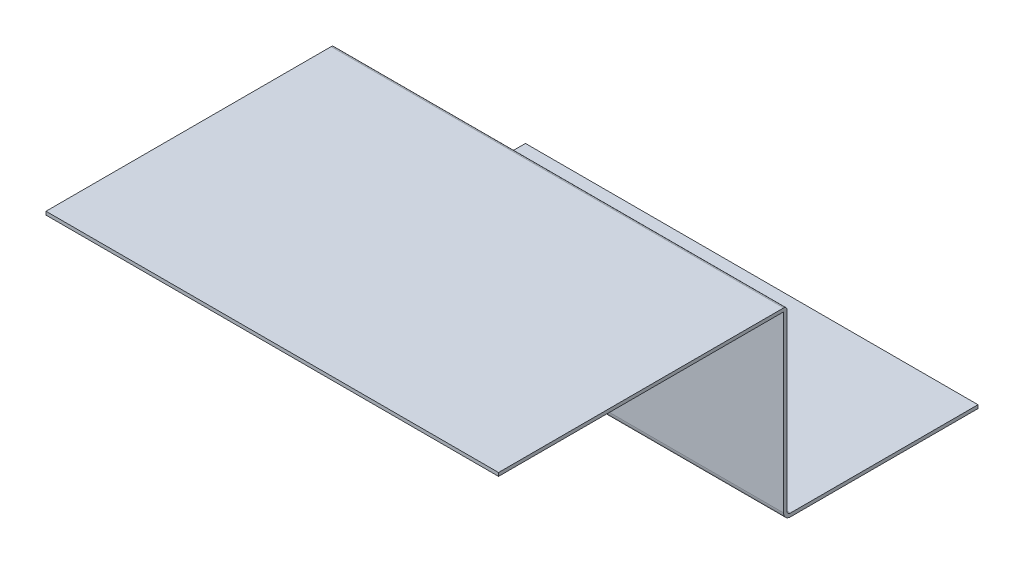
ISO-10303-21;
HEADER;
FILE_DESCRIPTION(('STEP AP214'),'2;1');
FILE_NAME('part.step','',(''),(''),'','','');
FILE_SCHEMA(('AUTOMOTIVE_DESIGN { 1 0 10303 214 1 1 1 1 }'));
ENDSEC;
DATA;
#1=APPLICATION_CONTEXT('core data for automotive mechanical design processes');
#2=APPLICATION_PROTOCOL_DEFINITION('international standard','automotive_design',2000,#1);
#3=PRODUCT_CONTEXT('',#1,'mechanical');
#4=PRODUCT('Part','Part','',(#3));
#5=PRODUCT_RELATED_PRODUCT_CATEGORY('part','',(#4));
#6=PRODUCT_DEFINITION_FORMATION('','',#4);
#7=PRODUCT_DEFINITION_CONTEXT('part definition',#1,'design');
#8=PRODUCT_DEFINITION('design','',#6,#7);
#9=PRODUCT_DEFINITION_SHAPE('','',#8);
#10=(LENGTH_UNIT() NAMED_UNIT(*) SI_UNIT(.MILLI.,.METRE.));
#11=(NAMED_UNIT(*) PLANE_ANGLE_UNIT() SI_UNIT($,.RADIAN.));
#12=(NAMED_UNIT(*) SI_UNIT($,.STERADIAN.) SOLID_ANGLE_UNIT());
#13=UNCERTAINTY_MEASURE_WITH_UNIT(LENGTH_MEASURE(1.E-05),#10,'distance_accuracy_value','');
#14=(GEOMETRIC_REPRESENTATION_CONTEXT(3) GLOBAL_UNCERTAINTY_ASSIGNED_CONTEXT((#13)) GLOBAL_UNIT_ASSIGNED_CONTEXT((#10,
#11,#12)) REPRESENTATION_CONTEXT('',''));
#15=CARTESIAN_POINT('',(0.,0.,0.));
#16=DIRECTION('',(0.,0.,1.));
#17=DIRECTION('',(1.,0.,0.));
#18=AXIS2_PLACEMENT_3D('',#15,#16,#17);
#19=CARTESIAN_POINT('',(400.,0.,255.));
#20=DIRECTION('',(0.,0.,-1.));
#21=DIRECTION('',(-1.,0.,0.));
#22=AXIS2_PLACEMENT_3D('',#19,#20,#21);
#23=PLANE('',#22);
#24=DIRECTION('',(0.,-1.,0.));
#25=VECTOR('',#24,1.);
#26=CARTESIAN_POINT('',(0.,0.,255.));
#27=LINE('',#26,#25);
#28=CARTESIAN_POINT('',(0.,0.,255.));
#29=VERTEX_POINT('',#28);
#30=CARTESIAN_POINT('',(0.,-3.,255.));
#31=VERTEX_POINT('',#30);
#32=EDGE_CURVE('E147',#29,#31,#27,.T.);
#33=ORIENTED_EDGE('',*,*,#32,.T.);
#34=DIRECTION('',(-1.,0.,0.));
#35=VECTOR('',#34,1.);
#36=CARTESIAN_POINT('',(400.,-3.,255.));
#37=LINE('',#36,#35);
#38=CARTESIAN_POINT('',(400.,-3.,255.));
#39=VERTEX_POINT('',#38);
#40=EDGE_CURVE('E11',#39,#31,#37,.T.);
#41=ORIENTED_EDGE('',*,*,#40,.F.);
#42=DIRECTION('',(0.,-1.,0.));
#43=VECTOR('',#42,1.);
#44=CARTESIAN_POINT('',(400.,0.,255.));
#45=LINE('',#44,#43);
#46=CARTESIAN_POINT('',(400.,0.,255.));
#47=VERTEX_POINT('',#46);
#48=EDGE_CURVE('E167',#47,#39,#45,.T.);
#49=ORIENTED_EDGE('',*,*,#48,.F.);
#50=DIRECTION('',(-1.,0.,0.));
#51=VECTOR('',#50,1.);
#52=CARTESIAN_POINT('',(400.,0.,255.));
#53=LINE('',#52,#51);
#54=EDGE_CURVE('E143',#47,#29,#53,.T.);
#55=ORIENTED_EDGE('',*,*,#54,.T.);
#56=EDGE_LOOP('',(#33,#41,#49,#55));
#57=FACE_BOUND('',#56,.T.);
#58=ADVANCED_FACE('F33',(#57),#23,.F.);
#59=CARTESIAN_POINT('',(400.,-3.00000000000002,3.));
#60=DIRECTION('',(0.,1.,0.));
#61=DIRECTION('',(0.,0.,1.));
#62=AXIS2_PLACEMENT_3D('',#59,#60,#61);
#63=PLANE('',#62);
#64=DIRECTION('',(0.,0.,-1.));
#65=VECTOR('',#64,1.);
#66=CARTESIAN_POINT('',(0.,-3.00000000000002,3.));
#67=LINE('',#66,#65);
#68=CARTESIAN_POINT('',(0.,-3.00000000000002,3.));
#69=VERTEX_POINT('',#68);
#70=EDGE_CURVE('E150',#31,#69,#67,.T.);
#71=ORIENTED_EDGE('',*,*,#70,.T.);
#72=DIRECTION('',(-1.,0.,0.));
#73=VECTOR('',#72,1.);
#74=CARTESIAN_POINT('',(400.,-3.00000000000002,3.));
#75=LINE('',#74,#73);
#76=CARTESIAN_POINT('',(400.,-3.00000000000002,3.));
#77=VERTEX_POINT('',#76);
#78=EDGE_CURVE('E41',#77,#69,#75,.T.);
#79=ORIENTED_EDGE('',*,*,#78,.F.);
#80=DIRECTION('',(0.,0.,-1.));
#81=VECTOR('',#80,1.);
#82=CARTESIAN_POINT('',(400.,-3.00000000000002,3.));
#83=LINE('',#82,#81);
#84=EDGE_CURVE('E101',#39,#77,#83,.T.);
#85=ORIENTED_EDGE('',*,*,#84,.F.);
#86=ORIENTED_EDGE('',*,*,#40,.T.);
#87=EDGE_LOOP('',(#71,#79,#85,#86));
#88=FACE_BOUND('',#87,.T.);
#89=ADVANCED_FACE('F239',(#88),#63,.F.);
#90=CARTESIAN_POINT('',(400.,-3.00000000000002,3.));
#91=DIRECTION('',(0.,0.,-1.));
#92=DIRECTION('',(0.,1.,0.));
#93=AXIS2_PLACEMENT_3D('',#90,#91,#92);
#94=PLANE('',#93);
#95=DIRECTION('',(0.,-1.,0.));
#96=VECTOR('',#95,1.);
#97=CARTESIAN_POINT('',(0.,-3.00000000000002,3.));
#98=LINE('',#97,#96);
#99=CARTESIAN_POINT('',(0.,-157.,2.99999999999998));
#100=VERTEX_POINT('',#99);
#101=EDGE_CURVE('E152',#69,#100,#98,.T.);
#102=ORIENTED_EDGE('',*,*,#101,.T.);
#103=DIRECTION('',(-1.,0.,0.));
#104=VECTOR('',#103,1.);
#105=CARTESIAN_POINT('',(400.,-157.,2.99999999999998));
#106=LINE('',#105,#104);
#107=CARTESIAN_POINT('',(400.,-157.,2.99999999999998));
#108=VERTEX_POINT('',#107);
#109=EDGE_CURVE('E183',#108,#100,#106,.T.);
#110=ORIENTED_EDGE('',*,*,#109,.F.);
#111=DIRECTION('',(0.,-1.,0.));
#112=VECTOR('',#111,1.);
#113=CARTESIAN_POINT('',(400.,-3.00000000000002,3.));
#114=LINE('',#113,#112);
#115=EDGE_CURVE('E191',#77,#108,#114,.T.);
#116=ORIENTED_EDGE('',*,*,#115,.F.);
#117=ORIENTED_EDGE('',*,*,#78,.T.);
#118=EDGE_LOOP('',(#102,#110,#116,#117));
#119=FACE_BOUND('',#118,.T.);
#120=ADVANCED_FACE('F189',(#119),#94,.F.);
#121=CARTESIAN_POINT('',(400.,-157.,-3.00000000000002));
#122=DIRECTION('',(-1.,0.,0.));
#123=DIRECTION('',(0.,0.,1.));
#124=AXIS2_PLACEMENT_3D('',#121,#122,#123);
#125=CYLINDRICAL_SURFACE('',#124,6.);
#126=CARTESIAN_POINT('',(0.,-157.,-3.00000000000002));
#127=DIRECTION('',(1.,0.,0.));
#128=DIRECTION('',(0.,0.,1.));
#129=AXIS2_PLACEMENT_3D('',#126,#127,#128);
#130=CIRCLE('',#129,6.);
#131=CARTESIAN_POINT('',(0.,-163.,-3.00000000000002));
#132=VERTEX_POINT('',#131);
#133=EDGE_CURVE('E154',#100,#132,#130,.T.);
#134=ORIENTED_EDGE('',*,*,#133,.T.);
#135=DIRECTION('',(-1.,0.,0.));
#136=VECTOR('',#135,1.);
#137=CARTESIAN_POINT('',(400.,-163.,-3.00000000000002));
#138=LINE('',#137,#136);
#139=CARTESIAN_POINT('',(400.,-163.,-3.00000000000002));
#140=VERTEX_POINT('',#139);
#141=EDGE_CURVE('E180',#140,#132,#138,.T.);
#142=ORIENTED_EDGE('',*,*,#141,.F.);
#143=CARTESIAN_POINT('',(400.,-157.,-3.00000000000002));
#144=DIRECTION('',(1.,0.,0.));
#145=DIRECTION('',(0.,0.,1.));
#146=AXIS2_PLACEMENT_3D('',#143,#144,#145);
#147=CIRCLE('',#146,6.);
#148=EDGE_CURVE('E209',#108,#140,#147,.T.);
#149=ORIENTED_EDGE('',*,*,#148,.F.);
#150=ORIENTED_EDGE('',*,*,#109,.T.);
#151=EDGE_LOOP('',(#134,#142,#149,#150));
#152=FACE_BOUND('',#151,.T.);
#153=ADVANCED_FACE('F200',(#152),#125,.T.);
#154=CARTESIAN_POINT('',(400.,-163.,-3.00000000000002));
#155=DIRECTION('',(0.,1.,0.));
#156=DIRECTION('',(0.,0.,1.));
#157=AXIS2_PLACEMENT_3D('',#154,#155,#156);
#158=PLANE('',#157);
#159=DIRECTION('',(0.,0.,-1.));
#160=VECTOR('',#159,1.);
#161=CARTESIAN_POINT('',(0.,-163.,-3.00000000000002));
#162=LINE('',#161,#160);
#163=CARTESIAN_POINT('',(0.,-163.,-168.8));
#164=VERTEX_POINT('',#163);
#165=EDGE_CURVE('E156',#132,#164,#162,.T.);
#166=ORIENTED_EDGE('',*,*,#165,.T.);
#167=DIRECTION('',(-1.,0.,0.));
#168=VECTOR('',#167,1.);
#169=CARTESIAN_POINT('',(400.,-163.,-168.8));
#170=LINE('',#169,#168);
#171=CARTESIAN_POINT('',(400.,-163.,-168.8));
#172=VERTEX_POINT('',#171);
#173=EDGE_CURVE('E177',#172,#164,#170,.T.);
#174=ORIENTED_EDGE('',*,*,#173,.F.);
#175=DIRECTION('',(0.,0.,-1.));
#176=VECTOR('',#175,1.);
#177=CARTESIAN_POINT('',(400.,-163.,-3.00000000000002));
#178=LINE('',#177,#176);
#179=EDGE_CURVE('E206',#140,#172,#178,.T.);
#180=ORIENTED_EDGE('',*,*,#179,.F.);
#181=ORIENTED_EDGE('',*,*,#141,.T.);
#182=EDGE_LOOP('',(#166,#174,#180,#181));
#183=FACE_BOUND('',#182,.T.);
#184=ADVANCED_FACE('F204',(#183),#158,.F.);
#185=CARTESIAN_POINT('',(400.,-160.,-168.8));
#186=DIRECTION('',(0.,0.,1.));
#187=DIRECTION('',(1.,0.,0.));
#188=AXIS2_PLACEMENT_3D('',#185,#186,#187);
#189=PLANE('',#188);
#190=DIRECTION('',(0.,1.,0.));
#191=VECTOR('',#190,1.);
#192=CARTESIAN_POINT('',(0.,-160.,-168.8));
#193=LINE('',#192,#191);
#194=CARTESIAN_POINT('',(0.,-160.,-168.8));
#195=VERTEX_POINT('',#194);
#196=EDGE_CURVE('E158',#164,#195,#193,.T.);
#197=ORIENTED_EDGE('',*,*,#196,.T.);
#198=DIRECTION('',(-1.,0.,0.));
#199=VECTOR('',#198,1.);
#200=CARTESIAN_POINT('',(400.,-160.,-168.8));
#201=LINE('',#200,#199);
#202=CARTESIAN_POINT('',(400.,-160.,-168.8));
#203=VERTEX_POINT('',#202);
#204=EDGE_CURVE('E174',#203,#195,#201,.T.);
#205=ORIENTED_EDGE('',*,*,#204,.F.);
#206=DIRECTION('',(0.,1.,0.));
#207=VECTOR('',#206,1.);
#208=CARTESIAN_POINT('',(400.,-160.,-168.8));
#209=LINE('',#208,#207);
#210=EDGE_CURVE('E208',#172,#203,#209,.T.);
#211=ORIENTED_EDGE('',*,*,#210,.F.);
#212=ORIENTED_EDGE('',*,*,#173,.T.);
#213=EDGE_LOOP('',(#197,#205,#211,#212));
#214=FACE_BOUND('',#213,.T.);
#215=ADVANCED_FACE('F252',(#214),#189,.F.);
#216=CARTESIAN_POINT('',(400.,-160.,-3.00000000000002));
#217=DIRECTION('',(0.,-1.,0.));
#218=DIRECTION('',(0.,0.,-1.));
#219=AXIS2_PLACEMENT_3D('',#216,#217,#218);
#220=PLANE('',#219);
#221=DIRECTION('',(0.,0.,1.));
#222=VECTOR('',#221,1.);
#223=CARTESIAN_POINT('',(0.,-160.,-3.00000000000002));
#224=LINE('',#223,#222);
#225=CARTESIAN_POINT('',(0.,-160.,-3.00000000000002));
#226=VERTEX_POINT('',#225);
#227=EDGE_CURVE('E160',#195,#226,#224,.T.);
#228=ORIENTED_EDGE('',*,*,#227,.T.);
#229=DIRECTION('',(-1.,0.,0.));
#230=VECTOR('',#229,1.);
#231=CARTESIAN_POINT('',(400.,-160.,-3.00000000000002));
#232=LINE('',#231,#230);
#233=CARTESIAN_POINT('',(400.,-160.,-3.00000000000002));
#234=VERTEX_POINT('',#233);
#235=EDGE_CURVE('E171',#234,#226,#232,.T.);
#236=ORIENTED_EDGE('',*,*,#235,.F.);
#237=DIRECTION('',(0.,0.,1.));
#238=VECTOR('',#237,1.);
#239=CARTESIAN_POINT('',(400.,-160.,-3.00000000000002));
#240=LINE('',#239,#238);
#241=EDGE_CURVE('E211',#203,#234,#240,.T.);
#242=ORIENTED_EDGE('',*,*,#241,.F.);
#243=ORIENTED_EDGE('',*,*,#204,.T.);
#244=EDGE_LOOP('',(#228,#236,#242,#243));
#245=FACE_BOUND('',#244,.T.);
#246=ADVANCED_FACE('F220',(#245),#220,.F.);
#247=CARTESIAN_POINT('',(400.,-157.,-3.00000000000002));
#248=DIRECTION('',(-1.,0.,0.));
#249=DIRECTION('',(0.,0.,1.));
#250=AXIS2_PLACEMENT_3D('',#247,#248,#249);
#251=CYLINDRICAL_SURFACE('',#250,3.);
#252=CARTESIAN_POINT('',(0.,-157.,-3.00000000000002));
#253=DIRECTION('',(-1.,0.,0.));
#254=DIRECTION('',(0.,0.,1.));
#255=AXIS2_PLACEMENT_3D('',#252,#253,#254);
#256=CIRCLE('',#255,3.);
#257=CARTESIAN_POINT('',(0.,-157.,0.));
#258=VERTEX_POINT('',#257);
#259=EDGE_CURVE('E162',#226,#258,#256,.T.);
#260=ORIENTED_EDGE('',*,*,#259,.T.);
#261=DIRECTION('',(-1.,0.,0.));
#262=VECTOR('',#261,1.);
#263=CARTESIAN_POINT('',(400.,-157.,0.));
#264=LINE('',#263,#262);
#265=CARTESIAN_POINT('',(400.,-157.,0.));
#266=VERTEX_POINT('',#265);
#267=EDGE_CURVE('E138',#266,#258,#264,.T.);
#268=ORIENTED_EDGE('',*,*,#267,.F.);
#269=CARTESIAN_POINT('',(400.,-157.,-3.00000000000002));
#270=DIRECTION('',(-1.,0.,0.));
#271=DIRECTION('',(0.,0.,1.));
#272=AXIS2_PLACEMENT_3D('',#269,#270,#271);
#273=CIRCLE('',#272,3.);
#274=EDGE_CURVE('E129',#234,#266,#273,.T.);
#275=ORIENTED_EDGE('',*,*,#274,.F.);
#276=ORIENTED_EDGE('',*,*,#235,.T.);
#277=EDGE_LOOP('',(#260,#268,#275,#276));
#278=FACE_BOUND('',#277,.T.);
#279=ADVANCED_FACE('F224',(#278),#251,.F.);
#280=CARTESIAN_POINT('',(400.,-3.00000000000002,0.));
#281=DIRECTION('',(0.,0.,1.));
#282=DIRECTION('',(0.,-1.,0.));
#283=AXIS2_PLACEMENT_3D('',#280,#281,#282);
#284=PLANE('',#283);
#285=DIRECTION('',(0.,1.,0.));
#286=VECTOR('',#285,1.);
#287=CARTESIAN_POINT('',(0.,-3.00000000000002,0.));
#288=LINE('',#287,#286);
#289=CARTESIAN_POINT('',(0.,-3.00000000000002,0.));
#290=VERTEX_POINT('',#289);
#291=EDGE_CURVE('E137',#258,#290,#288,.T.);
#292=ORIENTED_EDGE('',*,*,#291,.T.);
#293=DIRECTION('',(-1.,0.,0.));
#294=VECTOR('',#293,1.);
#295=CARTESIAN_POINT('',(400.,-3.00000000000002,0.));
#296=LINE('',#295,#294);
#297=CARTESIAN_POINT('',(400.,-3.00000000000002,0.));
#298=VERTEX_POINT('',#297);
#299=EDGE_CURVE('E134',#298,#290,#296,.T.);
#300=ORIENTED_EDGE('',*,*,#299,.F.);
#301=DIRECTION('',(0.,1.,0.));
#302=VECTOR('',#301,1.);
#303=CARTESIAN_POINT('',(400.,-3.00000000000002,0.));
#304=LINE('',#303,#302);
#305=EDGE_CURVE('E123',#266,#298,#304,.T.);
#306=ORIENTED_EDGE('',*,*,#305,.F.);
#307=ORIENTED_EDGE('',*,*,#267,.T.);
#308=EDGE_LOOP('',(#292,#300,#306,#307));
#309=FACE_BOUND('',#308,.T.);
#310=ADVANCED_FACE('F135',(#309),#284,.F.);
#311=CARTESIAN_POINT('',(400.,-3.,3.));
#312=DIRECTION('',(-1.,0.,0.));
#313=DIRECTION('',(0.,0.,1.));
#314=AXIS2_PLACEMENT_3D('',#311,#312,#313);
#315=CYLINDRICAL_SURFACE('',#314,3.);
#316=CARTESIAN_POINT('',(0.,-3.,3.));
#317=DIRECTION('',(1.,0.,0.));
#318=DIRECTION('',(0.,0.,-1.));
#319=AXIS2_PLACEMENT_3D('',#316,#317,#318);
#320=CIRCLE('',#319,3.);
#321=CARTESIAN_POINT('',(0.,0.,3.00000000000002));
#322=VERTEX_POINT('',#321);
#323=EDGE_CURVE('E87',#290,#322,#320,.T.);
#324=ORIENTED_EDGE('',*,*,#323,.T.);
#325=DIRECTION('',(-1.,0.,0.));
#326=VECTOR('',#325,1.);
#327=CARTESIAN_POINT('',(400.,0.,3.00000000000002));
#328=LINE('',#327,#326);
#329=CARTESIAN_POINT('',(400.,0.,3.00000000000002));
#330=VERTEX_POINT('',#329);
#331=EDGE_CURVE('E139',#330,#322,#328,.T.);
#332=ORIENTED_EDGE('',*,*,#331,.F.);
#333=CARTESIAN_POINT('',(400.,-3.,3.));
#334=DIRECTION('',(1.,0.,0.));
#335=DIRECTION('',(0.,0.,-1.));
#336=AXIS2_PLACEMENT_3D('',#333,#334,#335);
#337=CIRCLE('',#336,3.);
#338=EDGE_CURVE('E127',#298,#330,#337,.T.);
#339=ORIENTED_EDGE('',*,*,#338,.F.);
#340=ORIENTED_EDGE('',*,*,#299,.T.);
#341=EDGE_LOOP('',(#324,#332,#339,#340));
#342=FACE_BOUND('',#341,.T.);
#343=ADVANCED_FACE('F141',(#342),#315,.T.);
#344=CARTESIAN_POINT('',(400.,0.,3.00000000000002));
#345=DIRECTION('',(0.,-1.,0.));
#346=DIRECTION('',(0.,0.,-1.));
#347=AXIS2_PLACEMENT_3D('',#344,#345,#346);
#348=PLANE('',#347);
#349=DIRECTION('',(0.,0.,1.));
#350=VECTOR('',#349,1.);
#351=CARTESIAN_POINT('',(0.,0.,3.00000000000002));
#352=LINE('',#351,#350);
#353=EDGE_CURVE('E93',#322,#29,#352,.T.);
#354=ORIENTED_EDGE('',*,*,#353,.T.);
#355=ORIENTED_EDGE('',*,*,#54,.F.);
#356=DIRECTION('',(0.,0.,1.));
#357=VECTOR('',#356,1.);
#358=CARTESIAN_POINT('',(400.,0.,3.00000000000002));
#359=LINE('',#358,#357);
#360=EDGE_CURVE('E49',#330,#47,#359,.T.);
#361=ORIENTED_EDGE('',*,*,#360,.F.);
#362=ORIENTED_EDGE('',*,*,#331,.T.);
#363=EDGE_LOOP('',(#354,#355,#361,#362));
#364=FACE_BOUND('',#363,.T.);
#365=ADVANCED_FACE('F228',(#364),#348,.F.);
#366=CARTESIAN_POINT('',(400.,-157.,-3.00000000000002));
#367=DIRECTION('',(-1.,0.,0.));
#368=DIRECTION('',(0.,0.,1.));
#369=AXIS2_PLACEMENT_3D('',#366,#367,#368);
#370=PLANE('',#369);
#371=ORIENTED_EDGE('',*,*,#48,.T.);
#372=ORIENTED_EDGE('',*,*,#84,.T.);
#373=ORIENTED_EDGE('',*,*,#115,.T.);
#374=ORIENTED_EDGE('',*,*,#148,.T.);
#375=ORIENTED_EDGE('',*,*,#179,.T.);
#376=ORIENTED_EDGE('',*,*,#210,.T.);
#377=ORIENTED_EDGE('',*,*,#241,.T.);
#378=ORIENTED_EDGE('',*,*,#274,.T.);
#379=ORIENTED_EDGE('',*,*,#305,.T.);
#380=ORIENTED_EDGE('',*,*,#338,.T.);
#381=ORIENTED_EDGE('',*,*,#360,.T.);
#382=EDGE_LOOP('',(#371,#372,#373,#374,#375,#376,#377,#378,#379,#380,#381));
#383=FACE_BOUND('',#382,.T.);
#384=ADVANCED_FACE('F125',(#383),#370,.F.);
#385=CARTESIAN_POINT('',(0.,-157.,-3.00000000000002));
#386=DIRECTION('',(-1.,0.,0.));
#387=DIRECTION('',(0.,0.,1.));
#388=AXIS2_PLACEMENT_3D('',#385,#386,#387);
#389=PLANE('',#388);
#390=ORIENTED_EDGE('',*,*,#32,.F.);
#391=ORIENTED_EDGE('',*,*,#353,.F.);
#392=ORIENTED_EDGE('',*,*,#323,.F.);
#393=ORIENTED_EDGE('',*,*,#291,.F.);
#394=ORIENTED_EDGE('',*,*,#259,.F.);
#395=ORIENTED_EDGE('',*,*,#227,.F.);
#396=ORIENTED_EDGE('',*,*,#196,.F.);
#397=ORIENTED_EDGE('',*,*,#165,.F.);
#398=ORIENTED_EDGE('',*,*,#133,.F.);
#399=ORIENTED_EDGE('',*,*,#101,.F.);
#400=ORIENTED_EDGE('',*,*,#70,.F.);
#401=EDGE_LOOP('',(#390,#391,#392,#393,#394,#395,#396,#397,#398,#399,#400));
#402=FACE_BOUND('',#401,.T.);
#403=ADVANCED_FACE('F195',(#402),#389,.T.);
#404=CLOSED_SHELL('',(#58,#89,#120,#153,#184,#215,#246,#279,#310,#343,#365,#384,#403));
#405=MANIFOLD_SOLID_BREP('B2',#404);
#406=ADVANCED_BREP_SHAPE_REPRESENTATION('',(#18,#405),#14);
#407=SHAPE_DEFINITION_REPRESENTATION(#9,#406);
ENDSEC;
END-ISO-10303-21;
